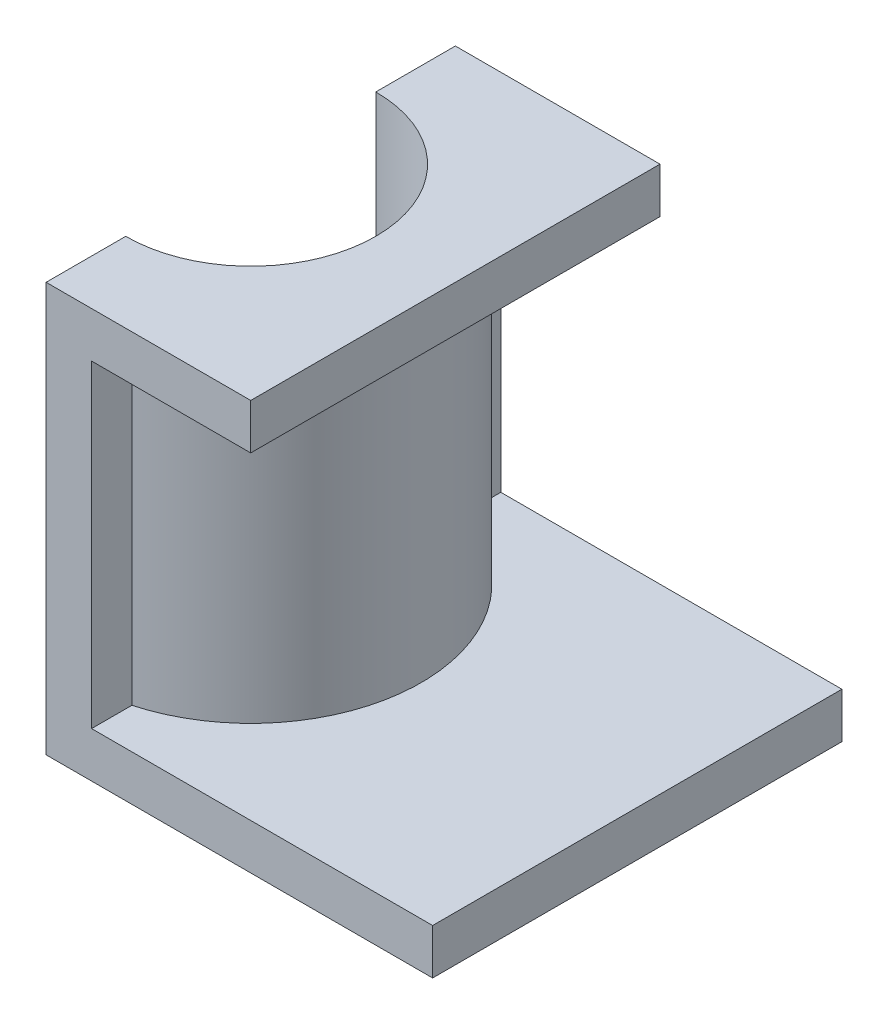
ISO-10303-21;
HEADER;
FILE_DESCRIPTION(('STEP AP214'),'2;1');
FILE_NAME('part.step','',(''),(''),'','','');
FILE_SCHEMA(('AUTOMOTIVE_DESIGN { 1 0 10303 214 1 1 1 1 }'));
ENDSEC;
DATA;
#1=APPLICATION_CONTEXT('core data for automotive mechanical design processes');
#2=APPLICATION_PROTOCOL_DEFINITION('international standard','automotive_design',2000,#1);
#3=PRODUCT_CONTEXT('',#1,'mechanical');
#4=PRODUCT('Part','Part','',(#3));
#5=PRODUCT_RELATED_PRODUCT_CATEGORY('part','',(#4));
#6=PRODUCT_DEFINITION_FORMATION('','',#4);
#7=PRODUCT_DEFINITION_CONTEXT('part definition',#1,'design');
#8=PRODUCT_DEFINITION('design','',#6,#7);
#9=PRODUCT_DEFINITION_SHAPE('','',#8);
#10=(LENGTH_UNIT() NAMED_UNIT(*) SI_UNIT(.MILLI.,.METRE.));
#11=(NAMED_UNIT(*) PLANE_ANGLE_UNIT() SI_UNIT($,.RADIAN.));
#12=(NAMED_UNIT(*) SI_UNIT($,.STERADIAN.) SOLID_ANGLE_UNIT());
#13=UNCERTAINTY_MEASURE_WITH_UNIT(LENGTH_MEASURE(1.E-05),#10,'distance_accuracy_value','');
#14=(GEOMETRIC_REPRESENTATION_CONTEXT(3) GLOBAL_UNCERTAINTY_ASSIGNED_CONTEXT((#13)) GLOBAL_UNIT_ASSIGNED_CONTEXT((#10,
#11,#12)) REPRESENTATION_CONTEXT('',''));
#15=CARTESIAN_POINT('',(0.,0.,0.));
#16=DIRECTION('',(0.,0.,1.));
#17=DIRECTION('',(1.,0.,0.));
#18=AXIS2_PLACEMENT_3D('',#15,#16,#17);
#19=CARTESIAN_POINT('',(0.1,0.,-0.275));
#20=DIRECTION('',(1.,0.,0.));
#21=DIRECTION('',(0.,1.,0.));
#22=AXIS2_PLACEMENT_3D('',#19,#20,#21);
#23=PLANE('',#22);
#24=DIRECTION('',(0.,0.,-1.));
#25=VECTOR('',#24,1.);
#26=CARTESIAN_POINT('',(0.1,0.1,-0.1375));
#27=LINE('',#26,#25);
#28=CARTESIAN_POINT('',(0.0999999999999644,0.1,-0.361420807370311));
#29=VERTEX_POINT('',#28);
#30=CARTESIAN_POINT('',(0.1,0.1,-0.45));
#31=VERTEX_POINT('',#30);
#32=EDGE_CURVE('E11',#29,#31,#27,.T.);
#33=ORIENTED_EDGE('',*,*,#32,.T.);
#34=DIRECTION('',(0.,1.,0.));
#35=VECTOR('',#34,1.);
#36=CARTESIAN_POINT('',(0.1,0.,-0.45));
#37=LINE('',#36,#35);
#38=CARTESIAN_POINT('',(0.1,0.8,-0.45));
#39=VERTEX_POINT('',#38);
#40=EDGE_CURVE('E28',#31,#39,#37,.T.);
#41=ORIENTED_EDGE('',*,*,#40,.T.);
#42=DIRECTION('',(0.,0.,-1.));
#43=VECTOR('',#42,1.);
#44=CARTESIAN_POINT('',(0.1,0.8,-0.1375));
#45=LINE('',#44,#43);
#46=CARTESIAN_POINT('',(0.0999999999999644,0.8,-0.361420807370311));
#47=VERTEX_POINT('',#46);
#48=EDGE_CURVE('E146',#47,#39,#45,.T.);
#49=ORIENTED_EDGE('',*,*,#48,.F.);
#50=DIRECTION('',(0.,1.,0.));
#51=VECTOR('',#50,1.);
#52=CARTESIAN_POINT('',(0.1,0.,-0.361420807370024));
#53=LINE('',#52,#51);
#54=EDGE_CURVE('E174',#29,#47,#53,.T.);
#55=ORIENTED_EDGE('',*,*,#54,.F.);
#56=EDGE_LOOP('',(#33,#41,#49,#55));
#57=FACE_BOUND('',#56,.T.);
#58=ADVANCED_FACE('F17',(#57),#23,.T.);
#59=CARTESIAN_POINT('',(0.,0.,0.));
#60=DIRECTION('',(0.,-1.,0.));
#61=DIRECTION('',(0.,0.,-1.));
#62=AXIS2_PLACEMENT_3D('',#59,#60,#61);
#63=CYLINDRICAL_SURFACE('',#62,0.375);
#64=CARTESIAN_POINT('',(0.,0.1,0.));
#65=DIRECTION('',(0.,-1.,0.));
#66=DIRECTION('',(0.,0.,-1.));
#67=AXIS2_PLACEMENT_3D('',#64,#65,#66);
#68=CIRCLE('',#67,0.375);
#69=CARTESIAN_POINT('',(0.0999999999999644,0.1,0.361420807370311));
#70=VERTEX_POINT('',#69);
#71=EDGE_CURVE('E193',#29,#70,#68,.T.);
#72=ORIENTED_EDGE('',*,*,#71,.F.);
#73=ORIENTED_EDGE('',*,*,#54,.T.);
#74=CARTESIAN_POINT('',(0.,0.8,0.));
#75=DIRECTION('',(0.,1.,0.));
#76=DIRECTION('',(0.,0.,-1.));
#77=AXIS2_PLACEMENT_3D('',#74,#75,#76);
#78=CIRCLE('',#77,0.375);
#79=CARTESIAN_POINT('',(0.0999999999999644,0.8,0.361420807370311));
#80=VERTEX_POINT('',#79);
#81=EDGE_CURVE('E189',#80,#47,#78,.T.);
#82=ORIENTED_EDGE('',*,*,#81,.F.);
#83=DIRECTION('',(0.,1.,0.));
#84=VECTOR('',#83,1.);
#85=CARTESIAN_POINT('',(0.1,0.,0.361420807370024));
#86=LINE('',#85,#84);
#87=EDGE_CURVE('E179',#70,#80,#86,.T.);
#88=ORIENTED_EDGE('',*,*,#87,.F.);
#89=EDGE_LOOP('',(#72,#73,#82,#88));
#90=FACE_BOUND('',#89,.T.);
#91=ADVANCED_FACE('F294',(#90),#63,.T.);
#92=CARTESIAN_POINT('',(0.1,0.,0.45));
#93=DIRECTION('',(1.,0.,0.));
#94=DIRECTION('',(0.,1.,0.));
#95=AXIS2_PLACEMENT_3D('',#92,#93,#94);
#96=PLANE('',#95);
#97=DIRECTION('',(0.,0.,-1.));
#98=VECTOR('',#97,1.);
#99=CARTESIAN_POINT('',(0.1,0.1,0.225));
#100=LINE('',#99,#98);
#101=CARTESIAN_POINT('',(0.1,0.1,0.45));
#102=VERTEX_POINT('',#101);
#103=EDGE_CURVE('E201',#102,#70,#100,.T.);
#104=ORIENTED_EDGE('',*,*,#103,.T.);
#105=ORIENTED_EDGE('',*,*,#87,.T.);
#106=DIRECTION('',(0.,0.,-1.));
#107=VECTOR('',#106,1.);
#108=CARTESIAN_POINT('',(0.1,0.8,0.225));
#109=LINE('',#108,#107);
#110=CARTESIAN_POINT('',(0.1,0.8,0.45));
#111=VERTEX_POINT('',#110);
#112=EDGE_CURVE('E180',#111,#80,#109,.T.);
#113=ORIENTED_EDGE('',*,*,#112,.F.);
#114=DIRECTION('',(0.,-1.,0.));
#115=VECTOR('',#114,1.);
#116=CARTESIAN_POINT('',(0.1,0.,0.45));
#117=LINE('',#116,#115);
#118=EDGE_CURVE('E176',#111,#102,#117,.T.);
#119=ORIENTED_EDGE('',*,*,#118,.T.);
#120=EDGE_LOOP('',(#104,#105,#113,#119));
#121=FACE_BOUND('',#120,.T.);
#122=ADVANCED_FACE('F301',(#121),#96,.T.);
#123=CARTESIAN_POINT('',(0.225,0.8,0.));
#124=DIRECTION('',(0.,-1.,0.));
#125=DIRECTION('',(0.,0.,-1.));
#126=AXIS2_PLACEMENT_3D('',#123,#124,#125);
#127=PLANE('',#126);
#128=ORIENTED_EDGE('',*,*,#112,.T.);
#129=ORIENTED_EDGE('',*,*,#81,.T.);
#130=ORIENTED_EDGE('',*,*,#48,.T.);
#131=DIRECTION('',(1.,0.,0.));
#132=VECTOR('',#131,1.);
#133=CARTESIAN_POINT('',(0.1125,0.8,-0.45));
#134=LINE('',#133,#132);
#135=CARTESIAN_POINT('',(0.45,0.8,-0.45));
#136=VERTEX_POINT('',#135);
#137=EDGE_CURVE('E139',#39,#136,#134,.T.);
#138=ORIENTED_EDGE('',*,*,#137,.T.);
#139=DIRECTION('',(0.,0.,1.));
#140=VECTOR('',#139,1.);
#141=CARTESIAN_POINT('',(0.45,0.8,-0.225));
#142=LINE('',#141,#140);
#143=CARTESIAN_POINT('',(0.45,0.8,0.45));
#144=VERTEX_POINT('',#143);
#145=EDGE_CURVE('E127',#136,#144,#142,.T.);
#146=ORIENTED_EDGE('',*,*,#145,.T.);
#147=DIRECTION('',(-1.,0.,0.));
#148=VECTOR('',#147,1.);
#149=CARTESIAN_POINT('',(0.3375,0.8,0.45));
#150=LINE('',#149,#148);
#151=EDGE_CURVE('E140',#144,#111,#150,.T.);
#152=ORIENTED_EDGE('',*,*,#151,.T.);
#153=EDGE_LOOP('',(#128,#129,#130,#138,#146,#152));
#154=FACE_BOUND('',#153,.T.);
#155=ADVANCED_FACE('F143',(#154),#127,.T.);
#156=CARTESIAN_POINT('',(0.225,0.1,0.));
#157=DIRECTION('',(0.,-1.,0.));
#158=DIRECTION('',(0.,0.,-1.));
#159=AXIS2_PLACEMENT_3D('',#156,#157,#158);
#160=PLANE('',#159);
#161=ORIENTED_EDGE('',*,*,#103,.F.);
#162=DIRECTION('',(1.,0.,0.));
#163=VECTOR('',#162,1.);
#164=CARTESIAN_POINT('',(0.3375,0.1,0.45));
#165=LINE('',#164,#163);
#166=CARTESIAN_POINT('',(0.85,0.1,0.45));
#167=VERTEX_POINT('',#166);
#168=EDGE_CURVE('E185',#102,#167,#165,.T.);
#169=ORIENTED_EDGE('',*,*,#168,.T.);
#170=DIRECTION('',(0.,0.,-1.));
#171=VECTOR('',#170,1.);
#172=CARTESIAN_POINT('',(0.85,0.1,-0.225));
#173=LINE('',#172,#171);
#174=CARTESIAN_POINT('',(0.85,0.1,-0.45));
#175=VERTEX_POINT('',#174);
#176=EDGE_CURVE('E181',#167,#175,#173,.T.);
#177=ORIENTED_EDGE('',*,*,#176,.T.);
#178=DIRECTION('',(-1.,0.,0.));
#179=VECTOR('',#178,1.);
#180=CARTESIAN_POINT('',(0.1125,0.1,-0.45));
#181=LINE('',#180,#179);
#182=EDGE_CURVE('E186',#175,#31,#181,.T.);
#183=ORIENTED_EDGE('',*,*,#182,.T.);
#184=ORIENTED_EDGE('',*,*,#32,.F.);
#185=ORIENTED_EDGE('',*,*,#71,.T.);
#186=EDGE_LOOP('',(#161,#169,#177,#183,#184,#185));
#187=FACE_BOUND('',#186,.T.);
#188=ADVANCED_FACE('F19',(#187),#160,.F.);
#189=CARTESIAN_POINT('',(0.45,0.,0.45));
#190=DIRECTION('',(0.,0.,-1.));
#191=DIRECTION('',(0.,-1.,0.));
#192=AXIS2_PLACEMENT_3D('',#189,#190,#191);
#193=PLANE('',#192);
#194=ORIENTED_EDGE('',*,*,#151,.F.);
#195=DIRECTION('',(0.,1.,0.));
#196=VECTOR('',#195,1.);
#197=CARTESIAN_POINT('',(0.45,0.,0.45));
#198=LINE('',#197,#196);
#199=CARTESIAN_POINT('',(0.45,0.9,0.45));
#200=VERTEX_POINT('',#199);
#201=EDGE_CURVE('E135',#144,#200,#198,.T.);
#202=ORIENTED_EDGE('',*,*,#201,.T.);
#203=DIRECTION('',(-1.,0.,0.));
#204=VECTOR('',#203,1.);
#205=CARTESIAN_POINT('',(0.,0.9,0.45));
#206=LINE('',#205,#204);
#207=CARTESIAN_POINT('',(0.,0.9,0.45));
#208=VERTEX_POINT('',#207);
#209=EDGE_CURVE('E194',#200,#208,#206,.T.);
#210=ORIENTED_EDGE('',*,*,#209,.T.);
#211=DIRECTION('',(0.,1.,0.));
#212=VECTOR('',#211,1.);
#213=CARTESIAN_POINT('',(0.,0.,0.45));
#214=LINE('',#213,#212);
#215=CARTESIAN_POINT('',(0.,0.,0.45));
#216=VERTEX_POINT('',#215);
#217=EDGE_CURVE('E212',#216,#208,#214,.T.);
#218=ORIENTED_EDGE('',*,*,#217,.F.);
#219=DIRECTION('',(1.,0.,0.));
#220=VECTOR('',#219,1.);
#221=CARTESIAN_POINT('',(0.,0.,0.45));
#222=LINE('',#221,#220);
#223=CARTESIAN_POINT('',(0.85,0.,0.45));
#224=VERTEX_POINT('',#223);
#225=EDGE_CURVE('E168',#216,#224,#222,.T.);
#226=ORIENTED_EDGE('',*,*,#225,.T.);
#227=DIRECTION('',(0.,1.,0.));
#228=VECTOR('',#227,1.);
#229=CARTESIAN_POINT('',(0.85,0.,0.45));
#230=LINE('',#229,#228);
#231=EDGE_CURVE('E235',#224,#167,#230,.T.);
#232=ORIENTED_EDGE('',*,*,#231,.T.);
#233=ORIENTED_EDGE('',*,*,#168,.F.);
#234=ORIENTED_EDGE('',*,*,#118,.F.);
#235=EDGE_LOOP('',(#194,#202,#210,#218,#226,#232,#233,#234));
#236=FACE_BOUND('',#235,.T.);
#237=ADVANCED_FACE('F306',(#236),#193,.F.);
#238=CARTESIAN_POINT('',(0.85,0.,-0.45));
#239=DIRECTION('',(-1.,0.,0.));
#240=DIRECTION('',(0.,0.,1.));
#241=AXIS2_PLACEMENT_3D('',#238,#239,#240);
#242=PLANE('',#241);
#243=ORIENTED_EDGE('',*,*,#176,.F.);
#244=ORIENTED_EDGE('',*,*,#231,.F.);
#245=DIRECTION('',(0.,0.,-1.));
#246=VECTOR('',#245,1.);
#247=CARTESIAN_POINT('',(0.85,0.,-0.225));
#248=LINE('',#247,#246);
#249=CARTESIAN_POINT('',(0.85,0.,-0.45));
#250=VERTEX_POINT('',#249);
#251=EDGE_CURVE('E162',#224,#250,#248,.T.);
#252=ORIENTED_EDGE('',*,*,#251,.T.);
#253=DIRECTION('',(0.,1.,0.));
#254=VECTOR('',#253,1.);
#255=CARTESIAN_POINT('',(0.85,0.,-0.45));
#256=LINE('',#255,#254);
#257=EDGE_CURVE('E153',#250,#175,#256,.T.);
#258=ORIENTED_EDGE('',*,*,#257,.T.);
#259=EDGE_LOOP('',(#243,#244,#252,#258));
#260=FACE_BOUND('',#259,.T.);
#261=ADVANCED_FACE('F271',(#260),#242,.F.);
#262=CARTESIAN_POINT('',(0.45,0.,-0.45));
#263=DIRECTION('',(-1.,0.,0.));
#264=DIRECTION('',(0.,0.,1.));
#265=AXIS2_PLACEMENT_3D('',#262,#263,#264);
#266=PLANE('',#265);
#267=ORIENTED_EDGE('',*,*,#145,.F.);
#268=DIRECTION('',(0.,1.,0.));
#269=VECTOR('',#268,1.);
#270=CARTESIAN_POINT('',(0.45,0.,-0.45));
#271=LINE('',#270,#269);
#272=CARTESIAN_POINT('',(0.45,0.9,-0.45));
#273=VERTEX_POINT('',#272);
#274=EDGE_CURVE('E132',#136,#273,#271,.T.);
#275=ORIENTED_EDGE('',*,*,#274,.T.);
#276=DIRECTION('',(0.,0.,1.));
#277=VECTOR('',#276,1.);
#278=CARTESIAN_POINT('',(0.45,0.9,0.45));
#279=LINE('',#278,#277);
#280=EDGE_CURVE('E154',#273,#200,#279,.T.);
#281=ORIENTED_EDGE('',*,*,#280,.T.);
#282=ORIENTED_EDGE('',*,*,#201,.F.);
#283=EDGE_LOOP('',(#267,#275,#281,#282));
#284=FACE_BOUND('',#283,.T.);
#285=ADVANCED_FACE('F129',(#284),#266,.F.);
#286=CARTESIAN_POINT('',(0.,0.,-0.45));
#287=DIRECTION('',(0.,0.,1.));
#288=DIRECTION('',(1.,0.,0.));
#289=AXIS2_PLACEMENT_3D('',#286,#287,#288);
#290=PLANE('',#289);
#291=ORIENTED_EDGE('',*,*,#137,.F.);
#292=ORIENTED_EDGE('',*,*,#40,.F.);
#293=ORIENTED_EDGE('',*,*,#182,.F.);
#294=ORIENTED_EDGE('',*,*,#257,.F.);
#295=DIRECTION('',(-1.,0.,0.));
#296=VECTOR('',#295,1.);
#297=CARTESIAN_POINT('',(0.45,0.,-0.45));
#298=LINE('',#297,#296);
#299=CARTESIAN_POINT('',(0.,0.,-0.45));
#300=VERTEX_POINT('',#299);
#301=EDGE_CURVE('E164',#250,#300,#298,.T.);
#302=ORIENTED_EDGE('',*,*,#301,.T.);
#303=DIRECTION('',(0.,1.,0.));
#304=VECTOR('',#303,1.);
#305=CARTESIAN_POINT('',(0.,0.,-0.45));
#306=LINE('',#305,#304);
#307=CARTESIAN_POINT('',(0.,0.9,-0.45));
#308=VERTEX_POINT('',#307);
#309=EDGE_CURVE('E200',#300,#308,#306,.T.);
#310=ORIENTED_EDGE('',*,*,#309,.T.);
#311=DIRECTION('',(1.,0.,0.));
#312=VECTOR('',#311,1.);
#313=CARTESIAN_POINT('',(0.45,0.9,-0.45));
#314=LINE('',#313,#312);
#315=EDGE_CURVE('E151',#308,#273,#314,.T.);
#316=ORIENTED_EDGE('',*,*,#315,.T.);
#317=ORIENTED_EDGE('',*,*,#274,.F.);
#318=EDGE_LOOP('',(#291,#292,#293,#294,#302,#310,#316,#317));
#319=FACE_BOUND('',#318,.T.);
#320=ADVANCED_FACE('F149',(#319),#290,.F.);
#321=CARTESIAN_POINT('',(0.,0.,-0.275));
#322=DIRECTION('',(1.,0.,0.));
#323=DIRECTION('',(0.,1.,0.));
#324=AXIS2_PLACEMENT_3D('',#321,#322,#323);
#325=PLANE('',#324);
#326=DIRECTION('',(0.,0.,-1.));
#327=VECTOR('',#326,1.);
#328=CARTESIAN_POINT('',(0.,0.,-0.275));
#329=LINE('',#328,#327);
#330=CARTESIAN_POINT('',(0.,0.,-0.275));
#331=VERTEX_POINT('',#330);
#332=EDGE_CURVE('E229',#331,#300,#329,.T.);
#333=ORIENTED_EDGE('',*,*,#332,.F.);
#334=DIRECTION('',(0.,1.,0.));
#335=VECTOR('',#334,1.);
#336=CARTESIAN_POINT('',(0.,0.,-0.275));
#337=LINE('',#336,#335);
#338=CARTESIAN_POINT('',(0.,0.9,-0.275));
#339=VERTEX_POINT('',#338);
#340=EDGE_CURVE('E170',#331,#339,#337,.T.);
#341=ORIENTED_EDGE('',*,*,#340,.T.);
#342=DIRECTION('',(0.,0.,-1.));
#343=VECTOR('',#342,1.);
#344=CARTESIAN_POINT('',(0.,0.9,-0.275));
#345=LINE('',#344,#343);
#346=EDGE_CURVE('E78',#339,#308,#345,.T.);
#347=ORIENTED_EDGE('',*,*,#346,.T.);
#348=ORIENTED_EDGE('',*,*,#309,.F.);
#349=EDGE_LOOP('',(#333,#341,#347,#348));
#350=FACE_BOUND('',#349,.T.);
#351=ADVANCED_FACE('F249',(#350),#325,.F.);
#352=CARTESIAN_POINT('',(0.,0.,0.));
#353=DIRECTION('',(0.,-1.,0.));
#354=DIRECTION('',(0.,0.,-1.));
#355=AXIS2_PLACEMENT_3D('',#352,#353,#354);
#356=CYLINDRICAL_SURFACE('',#355,0.275);
#357=CARTESIAN_POINT('',(0.,0.,0.));
#358=DIRECTION('',(0.,-1.,0.));
#359=DIRECTION('',(0.,0.,-1.));
#360=AXIS2_PLACEMENT_3D('',#357,#358,#359);
#361=CIRCLE('',#360,0.275);
#362=CARTESIAN_POINT('',(0.,0.,0.275));
#363=VERTEX_POINT('',#362);
#364=EDGE_CURVE('E219',#331,#363,#361,.T.);
#365=ORIENTED_EDGE('',*,*,#364,.T.);
#366=DIRECTION('',(0.,1.,0.));
#367=VECTOR('',#366,1.);
#368=CARTESIAN_POINT('',(0.,0.,0.275));
#369=LINE('',#368,#367);
#370=CARTESIAN_POINT('',(0.,0.9,0.275));
#371=VERTEX_POINT('',#370);
#372=EDGE_CURVE('E93',#363,#371,#369,.T.);
#373=ORIENTED_EDGE('',*,*,#372,.T.);
#374=CARTESIAN_POINT('',(0.,0.9,0.));
#375=DIRECTION('',(0.,1.,0.));
#376=DIRECTION('',(0.,0.,-1.));
#377=AXIS2_PLACEMENT_3D('',#374,#375,#376);
#378=CIRCLE('',#377,0.275);
#379=EDGE_CURVE('E209',#371,#339,#378,.T.);
#380=ORIENTED_EDGE('',*,*,#379,.T.);
#381=ORIENTED_EDGE('',*,*,#340,.F.);
#382=EDGE_LOOP('',(#365,#373,#380,#381));
#383=FACE_BOUND('',#382,.T.);
#384=ADVANCED_FACE('F278',(#383),#356,.F.);
#385=CARTESIAN_POINT('',(0.,0.,0.45));
#386=DIRECTION('',(1.,0.,0.));
#387=DIRECTION('',(0.,1.,0.));
#388=AXIS2_PLACEMENT_3D('',#385,#386,#387);
#389=PLANE('',#388);
#390=DIRECTION('',(0.,0.,-1.));
#391=VECTOR('',#390,1.);
#392=CARTESIAN_POINT('',(0.,0.,0.45));
#393=LINE('',#392,#391);
#394=EDGE_CURVE('E225',#216,#363,#393,.T.);
#395=ORIENTED_EDGE('',*,*,#394,.F.);
#396=ORIENTED_EDGE('',*,*,#217,.T.);
#397=DIRECTION('',(0.,0.,-1.));
#398=VECTOR('',#397,1.);
#399=CARTESIAN_POINT('',(0.,0.9,0.45));
#400=LINE('',#399,#398);
#401=EDGE_CURVE('E21',#208,#371,#400,.T.);
#402=ORIENTED_EDGE('',*,*,#401,.T.);
#403=ORIENTED_EDGE('',*,*,#372,.F.);
#404=EDGE_LOOP('',(#395,#396,#402,#403));
#405=FACE_BOUND('',#404,.T.);
#406=ADVANCED_FACE('F279',(#405),#389,.F.);
#407=CARTESIAN_POINT('',(0.225,0.9,0.));
#408=DIRECTION('',(0.,-1.,0.));
#409=DIRECTION('',(0.,0.,-1.));
#410=AXIS2_PLACEMENT_3D('',#407,#408,#409);
#411=PLANE('',#410);
#412=ORIENTED_EDGE('',*,*,#401,.F.);
#413=ORIENTED_EDGE('',*,*,#209,.F.);
#414=ORIENTED_EDGE('',*,*,#280,.F.);
#415=ORIENTED_EDGE('',*,*,#315,.F.);
#416=ORIENTED_EDGE('',*,*,#346,.F.);
#417=ORIENTED_EDGE('',*,*,#379,.F.);
#418=EDGE_LOOP('',(#412,#413,#414,#415,#416,#417));
#419=FACE_BOUND('',#418,.T.);
#420=ADVANCED_FACE('F281',(#419),#411,.F.);
#421=CARTESIAN_POINT('',(0.225,0.,0.));
#422=DIRECTION('',(0.,-1.,0.));
#423=DIRECTION('',(0.,0.,-1.));
#424=AXIS2_PLACEMENT_3D('',#421,#422,#423);
#425=PLANE('',#424);
#426=ORIENTED_EDGE('',*,*,#394,.T.);
#427=ORIENTED_EDGE('',*,*,#364,.F.);
#428=ORIENTED_EDGE('',*,*,#332,.T.);
#429=ORIENTED_EDGE('',*,*,#301,.F.);
#430=ORIENTED_EDGE('',*,*,#251,.F.);
#431=ORIENTED_EDGE('',*,*,#225,.F.);
#432=EDGE_LOOP('',(#426,#427,#428,#429,#430,#431));
#433=FACE_BOUND('',#432,.T.);
#434=ADVANCED_FACE('F276',(#433),#425,.T.);
#435=CLOSED_SHELL('',(#58,#91,#122,#155,#188,#237,#261,#285,#320,#351,#384,#406,#420,#434));
#436=MANIFOLD_SOLID_BREP('B1',#435);
#437=ADVANCED_BREP_SHAPE_REPRESENTATION('',(#18,#436),#14);
#438=SHAPE_DEFINITION_REPRESENTATION(#9,#437);
ENDSEC;
END-ISO-10303-21;
